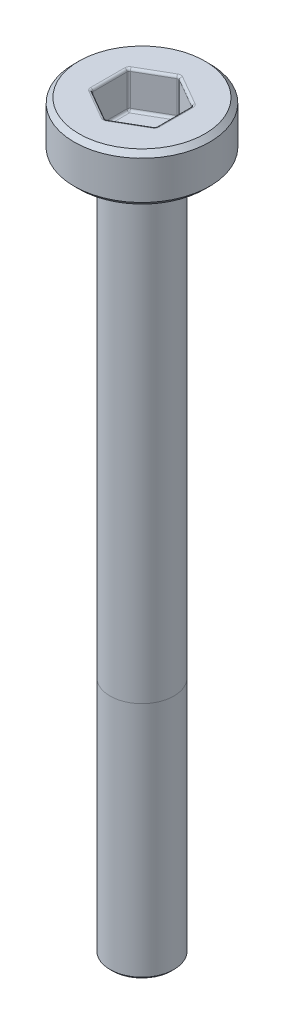
ISO-10303-21;
HEADER;
FILE_DESCRIPTION(('STEP AP214'),'2;1');
FILE_NAME('part.step','',(''),(''),'','','');
FILE_SCHEMA(('AUTOMOTIVE_DESIGN { 1 0 10303 214 1 1 1 1 }'));
ENDSEC;
DATA;
#1=APPLICATION_CONTEXT('core data for automotive mechanical design processes');
#2=APPLICATION_PROTOCOL_DEFINITION('international standard','automotive_design',2000,#1);
#3=PRODUCT_CONTEXT('',#1,'mechanical');
#4=PRODUCT('Part','Part','',(#3));
#5=PRODUCT_RELATED_PRODUCT_CATEGORY('part','',(#4));
#6=PRODUCT_DEFINITION_FORMATION('','',#4);
#7=PRODUCT_DEFINITION_CONTEXT('part definition',#1,'design');
#8=PRODUCT_DEFINITION('design','',#6,#7);
#9=PRODUCT_DEFINITION_SHAPE('','',#8);
#10=(LENGTH_UNIT() NAMED_UNIT(*) SI_UNIT(.MILLI.,.METRE.));
#11=(NAMED_UNIT(*) PLANE_ANGLE_UNIT() SI_UNIT($,.RADIAN.));
#12=(NAMED_UNIT(*) SI_UNIT($,.STERADIAN.) SOLID_ANGLE_UNIT());
#13=UNCERTAINTY_MEASURE_WITH_UNIT(LENGTH_MEASURE(1.E-05),#10,'distance_accuracy_value','');
#14=(GEOMETRIC_REPRESENTATION_CONTEXT(3) GLOBAL_UNCERTAINTY_ASSIGNED_CONTEXT((#13)) GLOBAL_UNIT_ASSIGNED_CONTEXT((#10,
#11,#12)) REPRESENTATION_CONTEXT('',''));
#15=CARTESIAN_POINT('',(0.,0.,0.));
#16=DIRECTION('',(0.,0.,1.));
#17=DIRECTION('',(1.,0.,0.));
#18=AXIS2_PLACEMENT_3D('',#15,#16,#17);
#19=CARTESIAN_POINT('',(0.,21.75,0.));
#20=DIRECTION('',(0.,-1.,0.));
#21=DIRECTION('',(0.,0.,-1.));
#22=AXIS2_PLACEMENT_3D('',#19,#20,#21);
#23=CYLINDRICAL_SURFACE('',#22,1.);
#24=CARTESIAN_POINT('',(0.,0.0750000000000056,0.));
#25=DIRECTION('',(0.,1.,0.));
#26=DIRECTION('',(0.,0.,1.));
#27=AXIS2_PLACEMENT_3D('',#24,#25,#26);
#28=CIRCLE('',#27,1.);
#29=CARTESIAN_POINT('',(0.,0.0750000000000056,1.));
#30=VERTEX_POINT('',#29);
#31=EDGE_CURVE('E319',#30,#30,#28,.T.);
#32=ORIENTED_EDGE('',*,*,#31,.T.);
#33=EDGE_LOOP('',(#32));
#34=FACE_BOUND('',#33,.T.);
#35=CARTESIAN_POINT('',(0.,7.5,0.));
#36=DIRECTION('',(0.,1.,0.));
#37=DIRECTION('',(0.,0.,1.));
#38=AXIS2_PLACEMENT_3D('',#35,#36,#37);
#39=CIRCLE('',#38,1.);
#40=CARTESIAN_POINT('',(0.,7.5,1.));
#41=VERTEX_POINT('',#40);
#42=EDGE_CURVE('E11',#41,#41,#39,.T.);
#43=ORIENTED_EDGE('',*,*,#42,.F.);
#44=EDGE_LOOP('',(#43));
#45=FACE_BOUND('',#44,.T.);
#46=ADVANCED_FACE('F38',(#34,#45),#23,.T.);
#47=ORIENTED_EDGE('',*,*,#42,.T.);
#48=EDGE_LOOP('',(#47));
#49=FACE_BOUND('',#48,.T.);
#50=CARTESIAN_POINT('',(0.,21.6,0.));
#51=DIRECTION('',(0.,1.,0.));
#52=DIRECTION('',(0.,0.,1.));
#53=AXIS2_PLACEMENT_3D('',#50,#51,#52);
#54=CIRCLE('',#53,1.);
#55=CARTESIAN_POINT('',(0.,21.6,1.));
#56=VERTEX_POINT('',#55);
#57=EDGE_CURVE('E300',#56,#56,#54,.F.);
#58=ORIENTED_EDGE('',*,*,#57,.T.);
#59=EDGE_LOOP('',(#58));
#60=FACE_BOUND('',#59,.T.);
#61=ADVANCED_FACE('F500',(#49,#60),#23,.T.);
#62=CARTESIAN_POINT('',(0.,0.,0.));
#63=DIRECTION('',(0.,1.,0.));
#64=DIRECTION('',(0.,0.,1.));
#65=AXIS2_PLACEMENT_3D('',#62,#63,#64);
#66=PLANE('',#65);
#67=CARTESIAN_POINT('',(0.,0.,0.));
#68=DIRECTION('',(0.,1.,0.));
#69=DIRECTION('',(0.,0.,1.));
#70=AXIS2_PLACEMENT_3D('',#67,#68,#69);
#71=CIRCLE('',#70,0.924999999999999);
#72=CARTESIAN_POINT('',(0.,0.,0.924999999999999));
#73=VERTEX_POINT('',#72);
#74=EDGE_CURVE('E207',#73,#73,#71,.F.);
#75=ORIENTED_EDGE('',*,*,#74,.T.);
#76=EDGE_LOOP('',(#75));
#77=FACE_BOUND('',#76,.T.);
#78=ADVANCED_FACE('F506',(#77),#66,.F.);
#79=CARTESIAN_POINT('',(0.,23.25,0.));
#80=DIRECTION('',(0.,-1.,0.));
#81=DIRECTION('',(0.,0.,-1.));
#82=AXIS2_PLACEMENT_3D('',#79,#80,#81);
#83=CYLINDRICAL_SURFACE('',#82,2.125);
#84=CARTESIAN_POINT('',(0.,23.1,0.));
#85=DIRECTION('',(0.,1.,0.));
#86=DIRECTION('',(0.,0.,1.));
#87=AXIS2_PLACEMENT_3D('',#84,#85,#86);
#88=CIRCLE('',#87,2.125);
#89=CARTESIAN_POINT('',(0.,23.1,2.125));
#90=VERTEX_POINT('',#89);
#91=EDGE_CURVE('E313',#90,#90,#88,.F.);
#92=ORIENTED_EDGE('',*,*,#91,.T.);
#93=EDGE_LOOP('',(#92));
#94=FACE_BOUND('',#93,.T.);
#95=CARTESIAN_POINT('',(0.,21.9,0.));
#96=DIRECTION('',(0.,1.,0.));
#97=DIRECTION('',(0.,0.,1.));
#98=AXIS2_PLACEMENT_3D('',#95,#96,#97);
#99=CIRCLE('',#98,2.125);
#100=CARTESIAN_POINT('',(0.,21.9,2.125));
#101=VERTEX_POINT('',#100);
#102=EDGE_CURVE('E310',#101,#101,#99,.T.);
#103=ORIENTED_EDGE('',*,*,#102,.T.);
#104=EDGE_LOOP('',(#103));
#105=FACE_BOUND('',#104,.T.);
#106=ADVANCED_FACE('F551',(#94,#105),#83,.T.);
#107=CARTESIAN_POINT('',(0.,23.25,0.));
#108=DIRECTION('',(0.,1.,0.));
#109=DIRECTION('',(0.,0.,1.));
#110=AXIS2_PLACEMENT_3D('',#107,#108,#109);
#111=PLANE('',#110);
#112=CARTESIAN_POINT('',(-0.925,23.25,0.534048999000404));
#113=DIRECTION('',(0.,1.,0.));
#114=DIRECTION('',(0.,0.,1.));
#115=AXIS2_PLACEMENT_3D('',#112,#113,#114);
#116=CIRCLE('',#115,0.15);
#117=CARTESIAN_POINT('',(-1.075,23.25,0.534048999000404));
#118=VERTEX_POINT('',#117);
#119=CARTESIAN_POINT('',(-1.,23.25,0.66395280956807));
#120=VERTEX_POINT('',#119);
#121=EDGE_CURVE('E349',#118,#120,#116,.T.);
#122=ORIENTED_EDGE('',*,*,#121,.F.);
#123=DIRECTION('',(0.,0.,1.));
#124=VECTOR('',#123,1.);
#125=CARTESIAN_POINT('',(-1.075,23.25,-0.577350269189626));
#126=LINE('',#125,#124);
#127=CARTESIAN_POINT('',(-1.075,23.25,-0.534048999000404));
#128=VERTEX_POINT('',#127);
#129=EDGE_CURVE('E355',#118,#128,#126,.F.);
#130=ORIENTED_EDGE('',*,*,#129,.T.);
#131=CARTESIAN_POINT('',(-0.925,23.25,-0.534048999000404));
#132=DIRECTION('',(0.,1.,0.));
#133=DIRECTION('',(0.,0.,1.));
#134=AXIS2_PLACEMENT_3D('',#131,#132,#133);
#135=CIRCLE('',#134,0.15);
#136=CARTESIAN_POINT('',(-1.,23.25,-0.663952809568069));
#137=VERTEX_POINT('',#136);
#138=EDGE_CURVE('E352',#137,#128,#135,.T.);
#139=ORIENTED_EDGE('',*,*,#138,.F.);
#140=DIRECTION('',(-0.866025403784439,0.,0.5));
#141=VECTOR('',#140,1.);
#142=CARTESIAN_POINT('',(-0.0375,23.25,-1.21965244366308));
#143=LINE('',#142,#141);
#144=CARTESIAN_POINT('',(-0.0750000000000002,23.25,-1.19800180856847));
#145=VERTEX_POINT('',#144);
#146=EDGE_CURVE('E347',#137,#145,#143,.F.);
#147=ORIENTED_EDGE('',*,*,#146,.T.);
#148=CARTESIAN_POINT('',(0.,23.25,-1.06809799800081));
#149=DIRECTION('',(0.,1.,0.));
#150=DIRECTION('',(0.,0.,1.));
#151=AXIS2_PLACEMENT_3D('',#148,#149,#150);
#152=CIRCLE('',#151,0.15);
#153=CARTESIAN_POINT('',(0.0749999999999997,23.25,-1.19800180856847));
#154=VERTEX_POINT('',#153);
#155=EDGE_CURVE('E344',#154,#145,#152,.T.);
#156=ORIENTED_EDGE('',*,*,#155,.F.);
#157=DIRECTION('',(-0.866025403784439,0.,-0.5));
#158=VECTOR('',#157,1.);
#159=CARTESIAN_POINT('',(1.0375,23.25,-0.642302174473459));
#160=LINE('',#159,#158);
#161=CARTESIAN_POINT('',(0.999999999999999,23.25,-0.66395280956807));
#162=VERTEX_POINT('',#161);
#163=EDGE_CURVE('E336',#154,#162,#160,.F.);
#164=ORIENTED_EDGE('',*,*,#163,.T.);
#165=CARTESIAN_POINT('',(0.924999999999999,23.25,-0.534048999000404));
#166=DIRECTION('',(0.,1.,0.));
#167=DIRECTION('',(0.,0.,1.));
#168=AXIS2_PLACEMENT_3D('',#165,#166,#167);
#169=CIRCLE('',#168,0.15);
#170=CARTESIAN_POINT('',(1.075,23.25,-0.534048999000404));
#171=VERTEX_POINT('',#170);
#172=EDGE_CURVE('E333',#171,#162,#169,.T.);
#173=ORIENTED_EDGE('',*,*,#172,.F.);
#174=DIRECTION('',(0.,0.,-1.));
#175=VECTOR('',#174,1.);
#176=CARTESIAN_POINT('',(1.075,23.25,0.577350269189626));
#177=LINE('',#176,#175);
#178=CARTESIAN_POINT('',(1.075,23.25,0.534048999000404));
#179=VERTEX_POINT('',#178);
#180=EDGE_CURVE('E329',#171,#179,#177,.F.);
#181=ORIENTED_EDGE('',*,*,#180,.T.);
#182=CARTESIAN_POINT('',(0.925,23.25,0.534048999000404));
#183=DIRECTION('',(0.,1.,0.));
#184=DIRECTION('',(0.,0.,1.));
#185=AXIS2_PLACEMENT_3D('',#182,#183,#184);
#186=CIRCLE('',#185,0.15);
#187=CARTESIAN_POINT('',(1.,23.25,0.66395280956807));
#188=VERTEX_POINT('',#187);
#189=EDGE_CURVE('E326',#188,#179,#186,.T.);
#190=ORIENTED_EDGE('',*,*,#189,.F.);
#191=DIRECTION('',(0.866025403784438,0.,-0.5));
#192=VECTOR('',#191,1.);
#193=CARTESIAN_POINT('',(0.0375000000000006,23.25,1.21965244366308));
#194=LINE('',#193,#192);
#195=CARTESIAN_POINT('',(0.0750000000000007,23.25,1.19800180856847));
#196=VERTEX_POINT('',#195);
#197=EDGE_CURVE('E331',#188,#196,#194,.F.);
#198=ORIENTED_EDGE('',*,*,#197,.T.);
#199=CARTESIAN_POINT('',(0.,23.25,1.06809799800081));
#200=DIRECTION('',(0.,1.,0.));
#201=DIRECTION('',(0.,0.,1.));
#202=AXIS2_PLACEMENT_3D('',#199,#200,#201);
#203=CIRCLE('',#202,0.15);
#204=CARTESIAN_POINT('',(-0.0749999999999991,23.25,1.19800180856847));
#205=VERTEX_POINT('',#204);
#206=EDGE_CURVE('E339',#205,#196,#203,.T.);
#207=ORIENTED_EDGE('',*,*,#206,.F.);
#208=DIRECTION('',(0.866025403784439,0.,0.5));
#209=VECTOR('',#208,1.);
#210=CARTESIAN_POINT('',(-1.0375,23.25,0.642302174473459));
#211=LINE('',#210,#209);
#212=EDGE_CURVE('E342',#205,#120,#211,.F.);
#213=ORIENTED_EDGE('',*,*,#212,.T.);
#214=EDGE_LOOP('',(#122,#130,#139,#147,#156,#164,#173,#181,#190,#198,#207,#213));
#215=FACE_BOUND('',#214,.T.);
#216=CARTESIAN_POINT('',(0.,23.25,0.));
#217=DIRECTION('',(0.,1.,0.));
#218=DIRECTION('',(0.,0.,1.));
#219=AXIS2_PLACEMENT_3D('',#216,#217,#218);
#220=CIRCLE('',#219,1.975);
#221=CARTESIAN_POINT('',(0.,23.25,1.975));
#222=VERTEX_POINT('',#221);
#223=EDGE_CURVE('E305',#222,#222,#220,.T.);
#224=ORIENTED_EDGE('',*,*,#223,.T.);
#225=EDGE_LOOP('',(#224));
#226=FACE_BOUND('',#225,.T.);
#227=ADVANCED_FACE('F450',(#215,#226),#111,.T.);
#228=CARTESIAN_POINT('',(0.,21.75,0.));
#229=DIRECTION('',(0.,1.,0.));
#230=DIRECTION('',(0.,0.,1.));
#231=AXIS2_PLACEMENT_3D('',#228,#229,#230);
#232=PLANE('',#231);
#233=CARTESIAN_POINT('',(0.,21.75,0.));
#234=DIRECTION('',(0.,1.,0.));
#235=DIRECTION('',(0.,0.,1.));
#236=AXIS2_PLACEMENT_3D('',#233,#234,#235);
#237=CIRCLE('',#236,1.975);
#238=CARTESIAN_POINT('',(0.,21.75,1.975));
#239=VERTEX_POINT('',#238);
#240=EDGE_CURVE('E316',#239,#239,#237,.F.);
#241=ORIENTED_EDGE('',*,*,#240,.T.);
#242=EDGE_LOOP('',(#241));
#243=FACE_BOUND('',#242,.T.);
#244=CARTESIAN_POINT('',(0.,21.75,0.));
#245=DIRECTION('',(0.,1.,0.));
#246=DIRECTION('',(0.,0.,1.));
#247=AXIS2_PLACEMENT_3D('',#244,#245,#246);
#248=CIRCLE('',#247,1.15);
#249=CARTESIAN_POINT('',(0.,21.75,1.15));
#250=VERTEX_POINT('',#249);
#251=EDGE_CURVE('E294',#250,#250,#248,.T.);
#252=ORIENTED_EDGE('',*,*,#251,.T.);
#253=EDGE_LOOP('',(#252));
#254=FACE_BOUND('',#253,.T.);
#255=ADVANCED_FACE('F516',(#243,#254),#232,.F.);
#256=CARTESIAN_POINT('',(0.,21.6,0.));
#257=DIRECTION('',(0.,1.,0.));
#258=DIRECTION('',(0.,0.,1.));
#259=AXIS2_PLACEMENT_3D('',#256,#257,#258);
#260=TOROIDAL_SURFACE('',#259,1.15,0.15);
#261=ORIENTED_EDGE('',*,*,#57,.F.);
#262=EDGE_LOOP('',(#261));
#263=FACE_BOUND('',#262,.T.);
#264=ORIENTED_EDGE('',*,*,#251,.F.);
#265=EDGE_LOOP('',(#264));
#266=FACE_BOUND('',#265,.T.);
#267=ADVANCED_FACE('F512',(#263,#266),#260,.F.);
#268=CARTESIAN_POINT('',(0.,23.25,0.));
#269=DIRECTION('',(0.,-1.,0.));
#270=DIRECTION('',(0.,0.,-1.));
#271=AXIS2_PLACEMENT_3D('',#268,#269,#270);
#272=CONICAL_SURFACE('',#271,1.975,0.785398163397443);
#273=ORIENTED_EDGE('',*,*,#91,.F.);
#274=EDGE_LOOP('',(#273));
#275=FACE_BOUND('',#274,.T.);
#276=ORIENTED_EDGE('',*,*,#223,.F.);
#277=EDGE_LOOP('',(#276));
#278=FACE_BOUND('',#277,.T.);
#279=ADVANCED_FACE('F515',(#275,#278),#272,.T.);
#280=CARTESIAN_POINT('',(0.,21.9,0.));
#281=DIRECTION('',(0.,1.,0.));
#282=DIRECTION('',(0.,0.,1.));
#283=AXIS2_PLACEMENT_3D('',#280,#281,#282);
#284=CONICAL_SURFACE('',#283,2.125,0.785398163397437);
#285=ORIENTED_EDGE('',*,*,#240,.F.);
#286=EDGE_LOOP('',(#285));
#287=FACE_BOUND('',#286,.T.);
#288=ORIENTED_EDGE('',*,*,#102,.F.);
#289=EDGE_LOOP('',(#288));
#290=FACE_BOUND('',#289,.T.);
#291=ADVANCED_FACE('F524',(#287,#290),#284,.T.);
#292=CARTESIAN_POINT('',(0.999999999999999,22.1,-0.577350269189626));
#293=DIRECTION('',(0.5,0.,-0.866025403784439));
#294=DIRECTION('',(-0.866025403784439,0.,-0.5));
#295=AXIS2_PLACEMENT_3D('',#292,#293,#294);
#296=PLANE('',#295);
#297=DIRECTION('',(0.,1.,0.));
#298=VECTOR('',#297,1.);
#299=CARTESIAN_POINT('',(0.962499999999999,23.25,-0.599000904284237));
#300=LINE('',#299,#298);
#301=CARTESIAN_POINT('',(0.962499999999999,22.175,-0.599000904284237));
#302=VERTEX_POINT('',#301);
#303=CARTESIAN_POINT('',(0.962499999999999,23.175,-0.599000904284237));
#304=VERTEX_POINT('',#303);
#305=EDGE_CURVE('E195',#302,#304,#300,.T.);
#306=ORIENTED_EDGE('',*,*,#305,.T.);
#307=DIRECTION('',(-0.866025403784439,0.,-0.5));
#308=VECTOR('',#307,1.);
#309=CARTESIAN_POINT('',(0.,23.175,-1.15470053837925));
#310=LINE('',#309,#308);
#311=CARTESIAN_POINT('',(0.0374999999999997,23.175,-1.13304990328464));
#312=VERTEX_POINT('',#311);
#313=EDGE_CURVE('E191',#304,#312,#310,.T.);
#314=ORIENTED_EDGE('',*,*,#313,.T.);
#315=DIRECTION('',(0.,1.,0.));
#316=VECTOR('',#315,1.);
#317=CARTESIAN_POINT('',(0.0374999999999997,22.1,-1.13304990328464));
#318=LINE('',#317,#316);
#319=CARTESIAN_POINT('',(0.0374999999999997,22.175,-1.13304990328464));
#320=VERTEX_POINT('',#319);
#321=EDGE_CURVE('E185',#312,#320,#318,.F.);
#322=ORIENTED_EDGE('',*,*,#321,.T.);
#323=DIRECTION('',(-0.866025403784439,0.,-0.5));
#324=VECTOR('',#323,1.);
#325=CARTESIAN_POINT('',(0.999999999999999,22.175,-0.577350269189626));
#326=LINE('',#325,#324);
#327=EDGE_CURVE('E188',#320,#302,#326,.F.);
#328=ORIENTED_EDGE('',*,*,#327,.T.);
#329=EDGE_LOOP('',(#306,#314,#322,#328));
#330=FACE_BOUND('',#329,.T.);
#331=ADVANCED_FACE('F187',(#330),#296,.F.);
#332=CARTESIAN_POINT('',(1.,22.1,0.577350269189626));
#333=DIRECTION('',(1.,0.,0.));
#334=DIRECTION('',(0.,0.,-1.));
#335=AXIS2_PLACEMENT_3D('',#332,#333,#334);
#336=PLANE('',#335);
#337=DIRECTION('',(0.,0.,-1.));
#338=VECTOR('',#337,1.);
#339=CARTESIAN_POINT('',(1.,22.175,0.577350269189626));
#340=LINE('',#339,#338);
#341=CARTESIAN_POINT('',(0.999999999999999,22.175,-0.534048999000404));
#342=VERTEX_POINT('',#341);
#343=CARTESIAN_POINT('',(1.,22.175,0.534048999000404));
#344=VERTEX_POINT('',#343);
#345=EDGE_CURVE('E394',#342,#344,#340,.F.);
#346=ORIENTED_EDGE('',*,*,#345,.T.);
#347=DIRECTION('',(0.,1.,0.));
#348=VECTOR('',#347,1.);
#349=CARTESIAN_POINT('',(1.,23.25,0.534048999000404));
#350=LINE('',#349,#348);
#351=CARTESIAN_POINT('',(1.,23.175,0.534048999000404));
#352=VERTEX_POINT('',#351);
#353=EDGE_CURVE('E399',#344,#352,#350,.T.);
#354=ORIENTED_EDGE('',*,*,#353,.T.);
#355=DIRECTION('',(0.,0.,-1.));
#356=VECTOR('',#355,1.);
#357=CARTESIAN_POINT('',(0.999999999999999,23.175,-0.577350269189626));
#358=LINE('',#357,#356);
#359=CARTESIAN_POINT('',(0.999999999999999,23.175,-0.534048999000404));
#360=VERTEX_POINT('',#359);
#361=EDGE_CURVE('E396',#352,#360,#358,.T.);
#362=ORIENTED_EDGE('',*,*,#361,.T.);
#363=DIRECTION('',(0.,1.,0.));
#364=VECTOR('',#363,1.);
#365=CARTESIAN_POINT('',(0.999999999999999,22.1,-0.534048999000404));
#366=LINE('',#365,#364);
#367=EDGE_CURVE('E392',#360,#342,#366,.F.);
#368=ORIENTED_EDGE('',*,*,#367,.T.);
#369=EDGE_LOOP('',(#346,#354,#362,#368));
#370=FACE_BOUND('',#369,.T.);
#371=ADVANCED_FACE('F438',(#370),#336,.F.);
#372=CARTESIAN_POINT('',(0.,22.1,1.15470053837925));
#373=DIRECTION('',(0.5,0.,0.866025403784439));
#374=DIRECTION('',(0.866025403784438,0.,-0.5));
#375=AXIS2_PLACEMENT_3D('',#372,#373,#374);
#376=PLANE('',#375);
#377=DIRECTION('',(0.866025403784438,0.,-0.5));
#378=VECTOR('',#377,1.);
#379=CARTESIAN_POINT('',(0.,22.175,1.15470053837925));
#380=LINE('',#379,#378);
#381=CARTESIAN_POINT('',(0.9625,22.175,0.599000904284237));
#382=VERTEX_POINT('',#381);
#383=CARTESIAN_POINT('',(0.0375000000000007,22.175,1.13304990328464));
#384=VERTEX_POINT('',#383);
#385=EDGE_CURVE('E385',#382,#384,#380,.F.);
#386=ORIENTED_EDGE('',*,*,#385,.T.);
#387=DIRECTION('',(0.,1.,0.));
#388=VECTOR('',#387,1.);
#389=CARTESIAN_POINT('',(0.0375000000000008,23.25,1.13304990328464));
#390=LINE('',#389,#388);
#391=CARTESIAN_POINT('',(0.0375000000000007,23.175,1.13304990328464));
#392=VERTEX_POINT('',#391);
#393=EDGE_CURVE('E390',#384,#392,#390,.T.);
#394=ORIENTED_EDGE('',*,*,#393,.T.);
#395=DIRECTION('',(0.866025403784438,0.,-0.5));
#396=VECTOR('',#395,1.);
#397=CARTESIAN_POINT('',(0.999999999999999,23.175,0.577350269189626));
#398=LINE('',#397,#396);
#399=CARTESIAN_POINT('',(0.9625,23.175,0.599000904284237));
#400=VERTEX_POINT('',#399);
#401=EDGE_CURVE('E387',#392,#400,#398,.T.);
#402=ORIENTED_EDGE('',*,*,#401,.T.);
#403=DIRECTION('',(0.,1.,0.));
#404=VECTOR('',#403,1.);
#405=CARTESIAN_POINT('',(0.9625,22.1,0.599000904284237));
#406=LINE('',#405,#404);
#407=EDGE_CURVE('E383',#400,#382,#406,.F.);
#408=ORIENTED_EDGE('',*,*,#407,.T.);
#409=EDGE_LOOP('',(#386,#394,#402,#408));
#410=FACE_BOUND('',#409,.T.);
#411=ADVANCED_FACE('F577',(#410),#376,.F.);
#412=CARTESIAN_POINT('',(-1.,22.1,0.577350269189626));
#413=DIRECTION('',(-0.5,0.,0.866025403784439));
#414=DIRECTION('',(0.866025403784439,0.,0.5));
#415=AXIS2_PLACEMENT_3D('',#412,#413,#414);
#416=PLANE('',#415);
#417=DIRECTION('',(0.866025403784439,0.,0.5));
#418=VECTOR('',#417,1.);
#419=CARTESIAN_POINT('',(-1.,22.175,0.577350269189626));
#420=LINE('',#419,#418);
#421=CARTESIAN_POINT('',(-0.0374999999999992,22.175,1.13304990328464));
#422=VERTEX_POINT('',#421);
#423=CARTESIAN_POINT('',(-0.9625,22.175,0.599000904284237));
#424=VERTEX_POINT('',#423);
#425=EDGE_CURVE('E376',#422,#424,#420,.F.);
#426=ORIENTED_EDGE('',*,*,#425,.T.);
#427=DIRECTION('',(0.,1.,0.));
#428=VECTOR('',#427,1.);
#429=CARTESIAN_POINT('',(-0.9625,23.25,0.599000904284237));
#430=LINE('',#429,#428);
#431=CARTESIAN_POINT('',(-0.9625,23.175,0.599000904284237));
#432=VERTEX_POINT('',#431);
#433=EDGE_CURVE('E381',#424,#432,#430,.T.);
#434=ORIENTED_EDGE('',*,*,#433,.T.);
#435=DIRECTION('',(0.866025403784439,0.,0.5));
#436=VECTOR('',#435,1.);
#437=CARTESIAN_POINT('',(0.,23.175,1.15470053837925));
#438=LINE('',#437,#436);
#439=CARTESIAN_POINT('',(-0.0374999999999992,23.175,1.13304990328464));
#440=VERTEX_POINT('',#439);
#441=EDGE_CURVE('E378',#432,#440,#438,.T.);
#442=ORIENTED_EDGE('',*,*,#441,.T.);
#443=DIRECTION('',(0.,1.,0.));
#444=VECTOR('',#443,1.);
#445=CARTESIAN_POINT('',(-0.0374999999999992,22.1,1.13304990328464));
#446=LINE('',#445,#444);
#447=EDGE_CURVE('E374',#440,#422,#446,.F.);
#448=ORIENTED_EDGE('',*,*,#447,.T.);
#449=EDGE_LOOP('',(#426,#434,#442,#448));
#450=FACE_BOUND('',#449,.T.);
#451=ADVANCED_FACE('F573',(#450),#416,.F.);
#452=CARTESIAN_POINT('',(-1.,22.1,-0.577350269189626));
#453=DIRECTION('',(-1.,0.,0.));
#454=DIRECTION('',(0.,0.,1.));
#455=AXIS2_PLACEMENT_3D('',#452,#453,#454);
#456=PLANE('',#455);
#457=DIRECTION('',(0.,0.,1.));
#458=VECTOR('',#457,1.);
#459=CARTESIAN_POINT('',(-1.,22.175,-0.577350269189626));
#460=LINE('',#459,#458);
#461=CARTESIAN_POINT('',(-1.,22.175,0.534048999000404));
#462=VERTEX_POINT('',#461);
#463=CARTESIAN_POINT('',(-1.,22.175,-0.534048999000404));
#464=VERTEX_POINT('',#463);
#465=EDGE_CURVE('E367',#462,#464,#460,.F.);
#466=ORIENTED_EDGE('',*,*,#465,.T.);
#467=DIRECTION('',(0.,1.,0.));
#468=VECTOR('',#467,1.);
#469=CARTESIAN_POINT('',(-1.,23.25,-0.534048999000404));
#470=LINE('',#469,#468);
#471=CARTESIAN_POINT('',(-1.,23.175,-0.534048999000404));
#472=VERTEX_POINT('',#471);
#473=EDGE_CURVE('E372',#464,#472,#470,.T.);
#474=ORIENTED_EDGE('',*,*,#473,.T.);
#475=DIRECTION('',(0.,0.,1.));
#476=VECTOR('',#475,1.);
#477=CARTESIAN_POINT('',(-1.,23.175,0.577350269189626));
#478=LINE('',#477,#476);
#479=CARTESIAN_POINT('',(-1.,23.175,0.534048999000404));
#480=VERTEX_POINT('',#479);
#481=EDGE_CURVE('E369',#472,#480,#478,.T.);
#482=ORIENTED_EDGE('',*,*,#481,.T.);
#483=DIRECTION('',(0.,1.,0.));
#484=VECTOR('',#483,1.);
#485=CARTESIAN_POINT('',(-1.,22.1,0.534048999000404));
#486=LINE('',#485,#484);
#487=EDGE_CURVE('E365',#480,#462,#486,.F.);
#488=ORIENTED_EDGE('',*,*,#487,.T.);
#489=EDGE_LOOP('',(#466,#474,#482,#488));
#490=FACE_BOUND('',#489,.T.);
#491=ADVANCED_FACE('F569',(#490),#456,.F.);
#492=CARTESIAN_POINT('',(0.,22.1,-1.15470053837925));
#493=DIRECTION('',(-0.5,0.,-0.866025403784439));
#494=DIRECTION('',(-0.866025403784439,0.,0.5));
#495=AXIS2_PLACEMENT_3D('',#492,#493,#494);
#496=PLANE('',#495);
#497=DIRECTION('',(-0.866025403784439,0.,0.5));
#498=VECTOR('',#497,1.);
#499=CARTESIAN_POINT('',(0.,22.175,-1.15470053837925));
#500=LINE('',#499,#498);
#501=CARTESIAN_POINT('',(-0.9625,22.175,-0.599000904284237));
#502=VERTEX_POINT('',#501);
#503=CARTESIAN_POINT('',(-0.0375000000000003,22.175,-1.13304990328464));
#504=VERTEX_POINT('',#503);
#505=EDGE_CURVE('E359',#502,#504,#500,.F.);
#506=ORIENTED_EDGE('',*,*,#505,.T.);
#507=DIRECTION('',(0.,1.,0.));
#508=VECTOR('',#507,1.);
#509=CARTESIAN_POINT('',(-0.0375000000000003,23.25,-1.13304990328464));
#510=LINE('',#509,#508);
#511=CARTESIAN_POINT('',(-0.0375000000000003,23.175,-1.13304990328464));
#512=VERTEX_POINT('',#511);
#513=EDGE_CURVE('E218',#504,#512,#510,.T.);
#514=ORIENTED_EDGE('',*,*,#513,.T.);
#515=DIRECTION('',(-0.866025403784439,0.,0.5));
#516=VECTOR('',#515,1.);
#517=CARTESIAN_POINT('',(-1.,23.175,-0.577350269189626));
#518=LINE('',#517,#516);
#519=CARTESIAN_POINT('',(-0.9625,23.175,-0.599000904284237));
#520=VERTEX_POINT('',#519);
#521=EDGE_CURVE('E361',#512,#520,#518,.T.);
#522=ORIENTED_EDGE('',*,*,#521,.T.);
#523=DIRECTION('',(0.,1.,0.));
#524=VECTOR('',#523,1.);
#525=CARTESIAN_POINT('',(-0.9625,22.1,-0.599000904284236));
#526=LINE('',#525,#524);
#527=EDGE_CURVE('E357',#520,#502,#526,.F.);
#528=ORIENTED_EDGE('',*,*,#527,.T.);
#529=EDGE_LOOP('',(#506,#514,#522,#528));
#530=FACE_BOUND('',#529,.T.);
#531=ADVANCED_FACE('F544',(#530),#496,.F.);
#532=CARTESIAN_POINT('',(0.,22.1,0.));
#533=DIRECTION('',(0.,1.,0.));
#534=DIRECTION('',(0.,0.,1.));
#535=AXIS2_PLACEMENT_3D('',#532,#533,#534);
#536=PLANE('',#535);
#537=DIRECTION('',(-0.866025403784439,0.,-0.5));
#538=VECTOR('',#537,1.);
#539=CARTESIAN_POINT('',(0.462499999999999,22.1,-0.801073498500606));
#540=LINE('',#539,#538);
#541=CARTESIAN_POINT('',(0.924999999999999,22.1,-0.534048999000404));
#542=VERTEX_POINT('',#541);
#543=CARTESIAN_POINT('',(0.,22.1,-1.06809799800081));
#544=VERTEX_POINT('',#543);
#545=EDGE_CURVE('E401',#542,#544,#540,.T.);
#546=ORIENTED_EDGE('',*,*,#545,.T.);
#547=DIRECTION('',(-0.866025403784439,0.,0.5));
#548=VECTOR('',#547,1.);
#549=CARTESIAN_POINT('',(-0.4625,22.1,-0.801073498500606));
#550=LINE('',#549,#548);
#551=CARTESIAN_POINT('',(-0.925,22.1,-0.534048999000404));
#552=VERTEX_POINT('',#551);
#553=EDGE_CURVE('E47',#544,#552,#550,.T.);
#554=ORIENTED_EDGE('',*,*,#553,.T.);
#555=DIRECTION('',(0.,0.,1.));
#556=VECTOR('',#555,1.);
#557=CARTESIAN_POINT('',(-0.925,22.1,0.));
#558=LINE('',#557,#556);
#559=CARTESIAN_POINT('',(-0.925,22.1,0.534048999000404));
#560=VERTEX_POINT('',#559);
#561=EDGE_CURVE('E62',#552,#560,#558,.T.);
#562=ORIENTED_EDGE('',*,*,#561,.T.);
#563=DIRECTION('',(0.866025403784439,0.,0.5));
#564=VECTOR('',#563,1.);
#565=CARTESIAN_POINT('',(-0.462499999999999,22.1,0.801073498500606));
#566=LINE('',#565,#564);
#567=CARTESIAN_POINT('',(0.,22.1,1.06809799800081));
#568=VERTEX_POINT('',#567);
#569=EDGE_CURVE('E407',#560,#568,#566,.T.);
#570=ORIENTED_EDGE('',*,*,#569,.T.);
#571=DIRECTION('',(0.866025403784438,0.,-0.5));
#572=VECTOR('',#571,1.);
#573=CARTESIAN_POINT('',(0.4625,22.1,0.801073498500606));
#574=LINE('',#573,#572);
#575=CARTESIAN_POINT('',(0.925,22.1,0.534048999000404));
#576=VERTEX_POINT('',#575);
#577=EDGE_CURVE('E405',#568,#576,#574,.T.);
#578=ORIENTED_EDGE('',*,*,#577,.T.);
#579=DIRECTION('',(0.,0.,-1.));
#580=VECTOR('',#579,1.);
#581=CARTESIAN_POINT('',(0.924999999999999,22.1,0.));
#582=LINE('',#581,#580);
#583=EDGE_CURVE('E403',#576,#542,#582,.T.);
#584=ORIENTED_EDGE('',*,*,#583,.T.);
#585=EDGE_LOOP('',(#546,#554,#562,#570,#578,#584));
#586=FACE_BOUND('',#585,.T.);
#587=ADVANCED_FACE('F536',(#586),#536,.T.);
#588=CARTESIAN_POINT('',(0.,0.0750000000000056,0.));
#589=DIRECTION('',(0.,1.,0.));
#590=DIRECTION('',(0.,0.,1.));
#591=AXIS2_PLACEMENT_3D('',#588,#589,#590);
#592=CONICAL_SURFACE('',#591,1.,0.785398163397419);
#593=ORIENTED_EDGE('',*,*,#74,.F.);
#594=EDGE_LOOP('',(#593));
#595=FACE_BOUND('',#594,.T.);
#596=ORIENTED_EDGE('',*,*,#31,.F.);
#597=EDGE_LOOP('',(#596));
#598=FACE_BOUND('',#597,.T.);
#599=ADVANCED_FACE('F532',(#595,#598),#592,.T.);
#600=CARTESIAN_POINT('',(-0.462499999999999,22.175,0.801073498500606));
#601=DIRECTION('',(0.866025403784439,0.,0.5));
#602=DIRECTION('',(0.5,0.,-0.866025403784439));
#603=AXIS2_PLACEMENT_3D('',#600,#601,#602);
#604=CYLINDRICAL_SURFACE('',#603,0.075);
#605=CARTESIAN_POINT('',(0.,22.175,1.06809799800081));
#606=DIRECTION('',(-0.866025403784437,0.,-0.500000000000003));
#607=DIRECTION('',(-0.500000000000003,0.,0.866025403784437));
#608=AXIS2_PLACEMENT_3D('',#605,#606,#607);
#609=CIRCLE('',#608,0.075);
#610=EDGE_CURVE('E292',#568,#422,#609,.T.);
#611=ORIENTED_EDGE('',*,*,#610,.F.);
#612=ORIENTED_EDGE('',*,*,#569,.F.);
#613=CARTESIAN_POINT('',(-0.925,22.175,0.534048999000404));
#614=DIRECTION('',(0.866025403784439,0.,0.499999999999999));
#615=DIRECTION('',(0.499999999999999,0.,-0.866025403784439));
#616=AXIS2_PLACEMENT_3D('',#613,#614,#615);
#617=CIRCLE('',#616,0.075);
#618=EDGE_CURVE('E290',#424,#560,#617,.T.);
#619=ORIENTED_EDGE('',*,*,#618,.F.);
#620=ORIENTED_EDGE('',*,*,#425,.F.);
#621=EDGE_LOOP('',(#611,#612,#619,#620));
#622=FACE_BOUND('',#621,.T.);
#623=ADVANCED_FACE('F40',(#622),#604,.F.);
#624=CARTESIAN_POINT('',(0.,22.175,1.06809799800081));
#625=DIRECTION('',(0.,0.,1.));
#626=DIRECTION('',(1.,0.,0.));
#627=AXIS2_PLACEMENT_3D('',#624,#625,#626);
#628=SPHERICAL_SURFACE('',#627,0.075);
#629=CARTESIAN_POINT('',(0.,22.175,1.06809799800081));
#630=DIRECTION('',(0.866025403784439,0.,-0.5));
#631=DIRECTION('',(-0.5,0.,-0.866025403784439));
#632=AXIS2_PLACEMENT_3D('',#629,#630,#631);
#633=CIRCLE('',#632,0.075);
#634=EDGE_CURVE('E284',#568,#384,#633,.F.);
#635=ORIENTED_EDGE('',*,*,#634,.F.);
#636=ORIENTED_EDGE('',*,*,#610,.T.);
#637=CARTESIAN_POINT('',(0.,22.175,1.06809799800081));
#638=DIRECTION('',(0.,1.,0.));
#639=DIRECTION('',(0.,0.,1.));
#640=AXIS2_PLACEMENT_3D('',#637,#638,#639);
#641=CIRCLE('',#640,0.075);
#642=EDGE_CURVE('E287',#384,#422,#641,.F.);
#643=ORIENTED_EDGE('',*,*,#642,.F.);
#644=EDGE_LOOP('',(#635,#636,#643));
#645=FACE_BOUND('',#644,.T.);
#646=ADVANCED_FACE('F542',(#645),#628,.F.);
#647=CARTESIAN_POINT('',(-0.925,22.175,0.534048999000404));
#648=DIRECTION('',(0.,0.,1.));
#649=DIRECTION('',(1.,0.,0.));
#650=AXIS2_PLACEMENT_3D('',#647,#648,#649);
#651=SPHERICAL_SURFACE('',#650,0.075);
#652=CARTESIAN_POINT('',(-0.925,22.175,0.534048999000404));
#653=DIRECTION('',(0.,1.,0.));
#654=DIRECTION('',(0.,0.,1.));
#655=AXIS2_PLACEMENT_3D('',#652,#653,#654);
#656=CIRCLE('',#655,0.075);
#657=EDGE_CURVE('E278',#424,#462,#656,.F.);
#658=ORIENTED_EDGE('',*,*,#657,.F.);
#659=ORIENTED_EDGE('',*,*,#618,.T.);
#660=CARTESIAN_POINT('',(-0.925,22.175,0.534048999000404));
#661=DIRECTION('',(0.,0.,-1.));
#662=DIRECTION('',(-1.,0.,0.));
#663=AXIS2_PLACEMENT_3D('',#660,#661,#662);
#664=CIRCLE('',#663,0.075);
#665=EDGE_CURVE('E281',#462,#560,#664,.F.);
#666=ORIENTED_EDGE('',*,*,#665,.F.);
#667=EDGE_LOOP('',(#658,#659,#666));
#668=FACE_BOUND('',#667,.T.);
#669=ADVANCED_FACE('F623',(#668),#651,.F.);
#670=CARTESIAN_POINT('',(0.,22.1,1.06809799800081));
#671=DIRECTION('',(0.,-1.,0.));
#672=DIRECTION('',(0.,0.,-1.));
#673=AXIS2_PLACEMENT_3D('',#670,#671,#672);
#674=CYLINDRICAL_SURFACE('',#673,0.075);
#675=ORIENTED_EDGE('',*,*,#642,.T.);
#676=ORIENTED_EDGE('',*,*,#447,.F.);
#677=CARTESIAN_POINT('',(0.,23.175,1.06809799800081));
#678=DIRECTION('',(0.,1.,0.));
#679=DIRECTION('',(0.,0.,1.));
#680=AXIS2_PLACEMENT_3D('',#677,#678,#679);
#681=CIRCLE('',#680,0.075);
#682=EDGE_CURVE('E273',#392,#440,#681,.F.);
#683=ORIENTED_EDGE('',*,*,#682,.F.);
#684=ORIENTED_EDGE('',*,*,#393,.F.);
#685=EDGE_LOOP('',(#675,#676,#683,#684));
#686=FACE_BOUND('',#685,.T.);
#687=ADVANCED_FACE('F631',(#686),#674,.F.);
#688=CARTESIAN_POINT('',(0.4625,22.175,0.801073498500606));
#689=DIRECTION('',(0.866025403784438,0.,-0.5));
#690=DIRECTION('',(-0.5,0.,-0.866025403784439));
#691=AXIS2_PLACEMENT_3D('',#688,#689,#690);
#692=CYLINDRICAL_SURFACE('',#691,0.075);
#693=ORIENTED_EDGE('',*,*,#634,.T.);
#694=ORIENTED_EDGE('',*,*,#385,.F.);
#695=CARTESIAN_POINT('',(0.925,22.175,0.534048999000404));
#696=DIRECTION('',(-0.866025403784437,0.,0.500000000000002));
#697=DIRECTION('',(0.500000000000002,0.,0.866025403784437));
#698=AXIS2_PLACEMENT_3D('',#695,#696,#697);
#699=CIRCLE('',#698,0.075);
#700=EDGE_CURVE('E270',#576,#382,#699,.T.);
#701=ORIENTED_EDGE('',*,*,#700,.F.);
#702=ORIENTED_EDGE('',*,*,#577,.F.);
#703=EDGE_LOOP('',(#693,#694,#701,#702));
#704=FACE_BOUND('',#703,.T.);
#705=ADVANCED_FACE('F641',(#704),#692,.F.);
#706=CARTESIAN_POINT('',(-0.925,22.175,0.));
#707=DIRECTION('',(0.,0.,1.));
#708=DIRECTION('',(1.,0.,0.));
#709=AXIS2_PLACEMENT_3D('',#706,#707,#708);
#710=CYLINDRICAL_SURFACE('',#709,0.075);
#711=ORIENTED_EDGE('',*,*,#665,.T.);
#712=ORIENTED_EDGE('',*,*,#561,.F.);
#713=CARTESIAN_POINT('',(-0.925,22.175,-0.534048999000404));
#714=DIRECTION('',(0.,0.,1.));
#715=DIRECTION('',(1.,0.,0.));
#716=AXIS2_PLACEMENT_3D('',#713,#714,#715);
#717=CIRCLE('',#716,0.075);
#718=EDGE_CURVE('E268',#464,#552,#717,.T.);
#719=ORIENTED_EDGE('',*,*,#718,.F.);
#720=ORIENTED_EDGE('',*,*,#465,.F.);
#721=EDGE_LOOP('',(#711,#712,#719,#720));
#722=FACE_BOUND('',#721,.T.);
#723=ADVANCED_FACE('F651',(#722),#710,.F.);
#724=CARTESIAN_POINT('',(-0.925,22.1,0.534048999000404));
#725=DIRECTION('',(0.,-1.,0.));
#726=DIRECTION('',(0.,0.,-1.));
#727=AXIS2_PLACEMENT_3D('',#724,#725,#726);
#728=CYLINDRICAL_SURFACE('',#727,0.075);
#729=ORIENTED_EDGE('',*,*,#657,.T.);
#730=ORIENTED_EDGE('',*,*,#487,.F.);
#731=CARTESIAN_POINT('',(-0.925,23.175,0.534048999000404));
#732=DIRECTION('',(0.,1.,0.));
#733=DIRECTION('',(0.,0.,1.));
#734=AXIS2_PLACEMENT_3D('',#731,#732,#733);
#735=CIRCLE('',#734,0.075);
#736=EDGE_CURVE('E265',#432,#480,#735,.F.);
#737=ORIENTED_EDGE('',*,*,#736,.F.);
#738=ORIENTED_EDGE('',*,*,#433,.F.);
#739=EDGE_LOOP('',(#729,#730,#737,#738));
#740=FACE_BOUND('',#739,.T.);
#741=ADVANCED_FACE('F661',(#740),#728,.F.);
#742=CARTESIAN_POINT('',(-1.0375,23.175,0.642302174473459));
#743=DIRECTION('',(-0.866025403784439,0.,-0.5));
#744=DIRECTION('',(-0.5,0.,0.866025403784439));
#745=AXIS2_PLACEMENT_3D('',#742,#743,#744);
#746=CYLINDRICAL_SURFACE('',#745,0.075);
#747=CARTESIAN_POINT('',(-1.,23.175,0.66395280956807));
#748=DIRECTION('',(-0.866025403784439,0.,-0.5));
#749=DIRECTION('',(-0.5,0.,0.866025403784439));
#750=AXIS2_PLACEMENT_3D('',#747,#748,#749);
#751=CIRCLE('',#750,0.075);
#752=EDGE_CURVE('E262',#120,#432,#751,.T.);
#753=ORIENTED_EDGE('',*,*,#752,.F.);
#754=ORIENTED_EDGE('',*,*,#212,.F.);
#755=CARTESIAN_POINT('',(-0.0749999999999991,23.175,1.19800180856847));
#756=DIRECTION('',(0.866025403784439,0.,0.5));
#757=DIRECTION('',(0.5,0.,-0.866025403784439));
#758=AXIS2_PLACEMENT_3D('',#755,#756,#757);
#759=CIRCLE('',#758,0.075);
#760=EDGE_CURVE('E275',#440,#205,#759,.T.);
#761=ORIENTED_EDGE('',*,*,#760,.F.);
#762=ORIENTED_EDGE('',*,*,#441,.F.);
#763=EDGE_LOOP('',(#753,#754,#761,#762));
#764=FACE_BOUND('',#763,.T.);
#765=ADVANCED_FACE('F463',(#764),#746,.T.);
#766=CARTESIAN_POINT('',(0.,23.175,1.06809799800081));
#767=DIRECTION('',(0.,1.,0.));
#768=DIRECTION('',(0.,0.,1.));
#769=AXIS2_PLACEMENT_3D('',#766,#767,#768);
#770=TOROIDAL_SURFACE('',#769,0.15,0.075);
#771=ORIENTED_EDGE('',*,*,#760,.T.);
#772=ORIENTED_EDGE('',*,*,#206,.T.);
#773=CARTESIAN_POINT('',(0.0750000000000007,23.175,1.19800180856847));
#774=DIRECTION('',(-0.866025403784439,0.,0.5));
#775=DIRECTION('',(0.5,0.,0.866025403784439));
#776=AXIS2_PLACEMENT_3D('',#773,#774,#775);
#777=CIRCLE('',#776,0.075);
#778=EDGE_CURVE('E259',#392,#196,#777,.F.);
#779=ORIENTED_EDGE('',*,*,#778,.F.);
#780=ORIENTED_EDGE('',*,*,#682,.T.);
#781=EDGE_LOOP('',(#771,#772,#779,#780));
#782=FACE_BOUND('',#781,.T.);
#783=ADVANCED_FACE('F457',(#782),#770,.T.);
#784=CARTESIAN_POINT('',(0.925,22.175,0.534048999000404));
#785=DIRECTION('',(0.,0.,1.));
#786=DIRECTION('',(1.,0.,0.));
#787=AXIS2_PLACEMENT_3D('',#784,#785,#786);
#788=SPHERICAL_SURFACE('',#787,0.075);
#789=CARTESIAN_POINT('',(0.925,22.175,0.534048999000404));
#790=DIRECTION('',(0.,0.,-1.));
#791=DIRECTION('',(0.,1.,0.));
#792=AXIS2_PLACEMENT_3D('',#789,#790,#791);
#793=CIRCLE('',#792,0.075);
#794=EDGE_CURVE('E253',#576,#344,#793,.F.);
#795=ORIENTED_EDGE('',*,*,#794,.F.);
#796=ORIENTED_EDGE('',*,*,#700,.T.);
#797=CARTESIAN_POINT('',(0.925,22.175,0.534048999000404));
#798=DIRECTION('',(0.,1.,0.));
#799=DIRECTION('',(0.,0.,1.));
#800=AXIS2_PLACEMENT_3D('',#797,#798,#799);
#801=CIRCLE('',#800,0.075);
#802=EDGE_CURVE('E256',#344,#382,#801,.F.);
#803=ORIENTED_EDGE('',*,*,#802,.F.);
#804=EDGE_LOOP('',(#795,#796,#803));
#805=FACE_BOUND('',#804,.T.);
#806=ADVANCED_FACE('F688',(#805),#788,.F.);
#807=CARTESIAN_POINT('',(-0.925,22.175,-0.534048999000404));
#808=DIRECTION('',(0.,0.,1.));
#809=DIRECTION('',(1.,0.,0.));
#810=AXIS2_PLACEMENT_3D('',#807,#808,#809);
#811=SPHERICAL_SURFACE('',#810,0.075);
#812=CARTESIAN_POINT('',(-0.925,22.175,-0.534048999000404));
#813=DIRECTION('',(0.,1.,0.));
#814=DIRECTION('',(0.,0.,1.));
#815=AXIS2_PLACEMENT_3D('',#812,#813,#814);
#816=CIRCLE('',#815,0.075);
#817=EDGE_CURVE('E249',#464,#502,#816,.F.);
#818=ORIENTED_EDGE('',*,*,#817,.F.);
#819=ORIENTED_EDGE('',*,*,#718,.T.);
#820=CARTESIAN_POINT('',(-0.925,22.175,-0.534048999000404));
#821=DIRECTION('',(0.866025403784439,0.,-0.499999999999999));
#822=DIRECTION('',(-0.499999999999999,0.,-0.866025403784439));
#823=AXIS2_PLACEMENT_3D('',#820,#821,#822);
#824=CIRCLE('',#823,0.075);
#825=EDGE_CURVE('E54',#502,#552,#824,.F.);
#826=ORIENTED_EDGE('',*,*,#825,.F.);
#827=EDGE_LOOP('',(#818,#819,#826));
#828=FACE_BOUND('',#827,.T.);
#829=ADVANCED_FACE('F697',(#828),#811,.F.);
#830=CARTESIAN_POINT('',(-0.925,23.175,0.534048999000404));
#831=DIRECTION('',(0.,1.,0.));
#832=DIRECTION('',(0.,0.,1.));
#833=AXIS2_PLACEMENT_3D('',#830,#831,#832);
#834=TOROIDAL_SURFACE('',#833,0.15,0.075);
#835=ORIENTED_EDGE('',*,*,#752,.T.);
#836=ORIENTED_EDGE('',*,*,#736,.T.);
#837=CARTESIAN_POINT('',(-1.075,23.175,0.534048999000404));
#838=DIRECTION('',(0.,0.,1.));
#839=DIRECTION('',(1.,0.,0.));
#840=AXIS2_PLACEMENT_3D('',#837,#838,#839);
#841=CIRCLE('',#840,0.075);
#842=EDGE_CURVE('E247',#118,#480,#841,.F.);
#843=ORIENTED_EDGE('',*,*,#842,.F.);
#844=ORIENTED_EDGE('',*,*,#121,.T.);
#845=EDGE_LOOP('',(#835,#836,#843,#844));
#846=FACE_BOUND('',#845,.T.);
#847=ADVANCED_FACE('F469',(#846),#834,.T.);
#848=CARTESIAN_POINT('',(0.0375000000000006,23.175,1.21965244366308));
#849=DIRECTION('',(-0.866025403784438,0.,0.5));
#850=DIRECTION('',(0.5,0.,0.866025403784439));
#851=AXIS2_PLACEMENT_3D('',#848,#849,#850);
#852=CYLINDRICAL_SURFACE('',#851,0.075);
#853=ORIENTED_EDGE('',*,*,#778,.T.);
#854=ORIENTED_EDGE('',*,*,#197,.F.);
#855=CARTESIAN_POINT('',(1.,23.175,0.66395280956807));
#856=DIRECTION('',(0.866025403784439,0.,-0.5));
#857=DIRECTION('',(-0.5,0.,-0.866025403784439));
#858=AXIS2_PLACEMENT_3D('',#855,#856,#857);
#859=CIRCLE('',#858,0.075);
#860=EDGE_CURVE('E244',#400,#188,#859,.T.);
#861=ORIENTED_EDGE('',*,*,#860,.F.);
#862=ORIENTED_EDGE('',*,*,#401,.F.);
#863=EDGE_LOOP('',(#853,#854,#861,#862));
#864=FACE_BOUND('',#863,.T.);
#865=ADVANCED_FACE('F453',(#864),#852,.T.);
#866=CARTESIAN_POINT('',(0.925,22.1,0.534048999000404));
#867=DIRECTION('',(0.,-1.,0.));
#868=DIRECTION('',(0.,0.,-1.));
#869=AXIS2_PLACEMENT_3D('',#866,#867,#868);
#870=CYLINDRICAL_SURFACE('',#869,0.075);
#871=ORIENTED_EDGE('',*,*,#802,.T.);
#872=ORIENTED_EDGE('',*,*,#407,.F.);
#873=CARTESIAN_POINT('',(0.925,23.175,0.534048999000404));
#874=DIRECTION('',(0.,1.,0.));
#875=DIRECTION('',(0.,0.,1.));
#876=AXIS2_PLACEMENT_3D('',#873,#874,#875);
#877=CIRCLE('',#876,0.075);
#878=EDGE_CURVE('E242',#352,#400,#877,.F.);
#879=ORIENTED_EDGE('',*,*,#878,.F.);
#880=ORIENTED_EDGE('',*,*,#353,.F.);
#881=EDGE_LOOP('',(#871,#872,#879,#880));
#882=FACE_BOUND('',#881,.T.);
#883=ADVANCED_FACE('F444',(#882),#870,.F.);
#884=CARTESIAN_POINT('',(0.924999999999999,22.175,0.));
#885=DIRECTION('',(0.,0.,-1.));
#886=DIRECTION('',(-1.,0.,0.));
#887=AXIS2_PLACEMENT_3D('',#884,#885,#886);
#888=CYLINDRICAL_SURFACE('',#887,0.075);
#889=ORIENTED_EDGE('',*,*,#794,.T.);
#890=ORIENTED_EDGE('',*,*,#345,.F.);
#891=CARTESIAN_POINT('',(0.924999999999999,22.175,-0.534048999000404));
#892=DIRECTION('',(0.,0.,1.));
#893=DIRECTION('',(1.,0.,0.));
#894=AXIS2_PLACEMENT_3D('',#891,#892,#893);
#895=CIRCLE('',#894,0.075);
#896=EDGE_CURVE('E239',#542,#342,#895,.T.);
#897=ORIENTED_EDGE('',*,*,#896,.F.);
#898=ORIENTED_EDGE('',*,*,#583,.F.);
#899=EDGE_LOOP('',(#889,#890,#897,#898));
#900=FACE_BOUND('',#899,.T.);
#901=ADVANCED_FACE('F732',(#900),#888,.F.);
#902=CARTESIAN_POINT('',(0.462499999999999,22.175,-0.801073498500606));
#903=DIRECTION('',(-0.866025403784439,0.,-0.5));
#904=DIRECTION('',(-0.5,0.,0.866025403784439));
#905=AXIS2_PLACEMENT_3D('',#902,#903,#904);
#906=CYLINDRICAL_SURFACE('',#905,0.075);
#907=CARTESIAN_POINT('',(0.,22.175,-1.06809799800081));
#908=DIRECTION('',(0.866025403784438,0.,0.500000000000001));
#909=DIRECTION('',(0.500000000000001,0.,-0.866025403784438));
#910=AXIS2_PLACEMENT_3D('',#907,#908,#909);
#911=CIRCLE('',#910,0.075);
#912=EDGE_CURVE('E202',#544,#320,#911,.T.);
#913=ORIENTED_EDGE('',*,*,#912,.F.);
#914=ORIENTED_EDGE('',*,*,#545,.F.);
#915=CARTESIAN_POINT('',(0.924999999999999,22.175,-0.534048999000404));
#916=DIRECTION('',(-0.866025403784439,0.,-0.5));
#917=DIRECTION('',(-0.5,0.,0.866025403784439));
#918=AXIS2_PLACEMENT_3D('',#915,#916,#917);
#919=CIRCLE('',#918,0.075);
#920=EDGE_CURVE('E205',#302,#542,#919,.T.);
#921=ORIENTED_EDGE('',*,*,#920,.F.);
#922=ORIENTED_EDGE('',*,*,#327,.F.);
#923=EDGE_LOOP('',(#913,#914,#921,#922));
#924=FACE_BOUND('',#923,.T.);
#925=ADVANCED_FACE('F200',(#924),#906,.F.);
#926=CARTESIAN_POINT('',(-0.4625,22.175,-0.801073498500606));
#927=DIRECTION('',(-0.866025403784439,0.,0.5));
#928=DIRECTION('',(0.5,0.,0.866025403784439));
#929=AXIS2_PLACEMENT_3D('',#926,#927,#928);
#930=CYLINDRICAL_SURFACE('',#929,0.075);
#931=ORIENTED_EDGE('',*,*,#825,.T.);
#932=ORIENTED_EDGE('',*,*,#553,.F.);
#933=CARTESIAN_POINT('',(0.,22.175,-1.06809799800081));
#934=DIRECTION('',(-0.866025403784439,0.,0.5));
#935=DIRECTION('',(0.5,0.,0.866025403784439));
#936=AXIS2_PLACEMENT_3D('',#933,#934,#935);
#937=CIRCLE('',#936,0.075);
#938=EDGE_CURVE('E215',#504,#544,#937,.T.);
#939=ORIENTED_EDGE('',*,*,#938,.F.);
#940=ORIENTED_EDGE('',*,*,#505,.F.);
#941=EDGE_LOOP('',(#931,#932,#939,#940));
#942=FACE_BOUND('',#941,.T.);
#943=ADVANCED_FACE('F750',(#942),#930,.F.);
#944=CARTESIAN_POINT('',(-0.925,22.1,-0.534048999000404));
#945=DIRECTION('',(0.,-1.,0.));
#946=DIRECTION('',(0.,0.,-1.));
#947=AXIS2_PLACEMENT_3D('',#944,#945,#946);
#948=CYLINDRICAL_SURFACE('',#947,0.075);
#949=ORIENTED_EDGE('',*,*,#817,.T.);
#950=ORIENTED_EDGE('',*,*,#527,.F.);
#951=CARTESIAN_POINT('',(-0.925,23.175,-0.534048999000404));
#952=DIRECTION('',(0.,1.,0.));
#953=DIRECTION('',(0.,0.,1.));
#954=AXIS2_PLACEMENT_3D('',#951,#952,#953);
#955=CIRCLE('',#954,0.075);
#956=EDGE_CURVE('E234',#472,#520,#955,.F.);
#957=ORIENTED_EDGE('',*,*,#956,.F.);
#958=ORIENTED_EDGE('',*,*,#473,.F.);
#959=EDGE_LOOP('',(#949,#950,#957,#958));
#960=FACE_BOUND('',#959,.T.);
#961=ADVANCED_FACE('F759',(#960),#948,.F.);
#962=CARTESIAN_POINT('',(-1.075,23.175,-0.577350269189626));
#963=DIRECTION('',(0.,0.,-1.));
#964=DIRECTION('',(-1.,0.,0.));
#965=AXIS2_PLACEMENT_3D('',#962,#963,#964);
#966=CYLINDRICAL_SURFACE('',#965,0.075);
#967=ORIENTED_EDGE('',*,*,#842,.T.);
#968=ORIENTED_EDGE('',*,*,#481,.F.);
#969=CARTESIAN_POINT('',(-1.075,23.175,-0.534048999000404));
#970=DIRECTION('',(0.,0.,-1.));
#971=DIRECTION('',(-1.,0.,0.));
#972=AXIS2_PLACEMENT_3D('',#969,#970,#971);
#973=CIRCLE('',#972,0.075);
#974=EDGE_CURVE('E231',#128,#472,#973,.T.);
#975=ORIENTED_EDGE('',*,*,#974,.F.);
#976=ORIENTED_EDGE('',*,*,#129,.F.);
#977=EDGE_LOOP('',(#967,#968,#975,#976));
#978=FACE_BOUND('',#977,.T.);
#979=ADVANCED_FACE('F475',(#978),#966,.T.);
#980=CARTESIAN_POINT('',(0.925,23.175,0.534048999000404));
#981=DIRECTION('',(0.,1.,0.));
#982=DIRECTION('',(0.,0.,1.));
#983=AXIS2_PLACEMENT_3D('',#980,#981,#982);
#984=TOROIDAL_SURFACE('',#983,0.15,0.075);
#985=ORIENTED_EDGE('',*,*,#860,.T.);
#986=ORIENTED_EDGE('',*,*,#189,.T.);
#987=CARTESIAN_POINT('',(1.075,23.175,0.534048999000404));
#988=DIRECTION('',(0.,0.,1.));
#989=DIRECTION('',(1.,0.,0.));
#990=AXIS2_PLACEMENT_3D('',#987,#988,#989);
#991=CIRCLE('',#990,0.075);
#992=EDGE_CURVE('E223',#352,#179,#991,.F.);
#993=ORIENTED_EDGE('',*,*,#992,.F.);
#994=ORIENTED_EDGE('',*,*,#878,.T.);
#995=EDGE_LOOP('',(#985,#986,#993,#994));
#996=FACE_BOUND('',#995,.T.);
#997=ADVANCED_FACE('F447',(#996),#984,.T.);
#998=CARTESIAN_POINT('',(0.924999999999999,22.175,-0.534048999000404));
#999=DIRECTION('',(0.,0.,1.));
#1000=DIRECTION('',(1.,0.,0.));
#1001=AXIS2_PLACEMENT_3D('',#998,#999,#1000);
#1002=SPHERICAL_SURFACE('',#1001,0.075);
#1003=ORIENTED_EDGE('',*,*,#920,.T.);
#1004=ORIENTED_EDGE('',*,*,#896,.T.);
#1005=CARTESIAN_POINT('',(0.924999999999999,22.175,-0.534048999000404));
#1006=DIRECTION('',(0.,1.,0.));
#1007=DIRECTION('',(0.,0.,1.));
#1008=AXIS2_PLACEMENT_3D('',#1005,#1006,#1007);
#1009=CIRCLE('',#1008,0.075);
#1010=EDGE_CURVE('E219',#302,#342,#1009,.F.);
#1011=ORIENTED_EDGE('',*,*,#1010,.F.);
#1012=EDGE_LOOP('',(#1003,#1004,#1011));
#1013=FACE_BOUND('',#1012,.T.);
#1014=ADVANCED_FACE('F785',(#1013),#1002,.F.);
#1015=CARTESIAN_POINT('',(0.,22.175,-1.06809799800081));
#1016=DIRECTION('',(0.,0.,1.));
#1017=DIRECTION('',(1.,0.,0.));
#1018=AXIS2_PLACEMENT_3D('',#1015,#1016,#1017);
#1019=SPHERICAL_SURFACE('',#1018,0.075);
#1020=ORIENTED_EDGE('',*,*,#938,.T.);
#1021=ORIENTED_EDGE('',*,*,#912,.T.);
#1022=CARTESIAN_POINT('',(0.,22.175,-1.06809799800081));
#1023=DIRECTION('',(0.,1.,0.));
#1024=DIRECTION('',(0.,0.,1.));
#1025=AXIS2_PLACEMENT_3D('',#1022,#1023,#1024);
#1026=CIRCLE('',#1025,0.075);
#1027=EDGE_CURVE('E212',#504,#320,#1026,.F.);
#1028=ORIENTED_EDGE('',*,*,#1027,.F.);
#1029=EDGE_LOOP('',(#1020,#1021,#1028));
#1030=FACE_BOUND('',#1029,.T.);
#1031=ADVANCED_FACE('F211',(#1030),#1019,.F.);
#1032=CARTESIAN_POINT('',(-0.925,23.175,-0.534048999000404));
#1033=DIRECTION('',(0.,1.,0.));
#1034=DIRECTION('',(0.,0.,1.));
#1035=AXIS2_PLACEMENT_3D('',#1032,#1033,#1034);
#1036=TOROIDAL_SURFACE('',#1035,0.15,0.075);
#1037=ORIENTED_EDGE('',*,*,#974,.T.);
#1038=ORIENTED_EDGE('',*,*,#956,.T.);
#1039=CARTESIAN_POINT('',(-1.,23.175,-0.663952809568069));
#1040=DIRECTION('',(-0.866025403784438,0.,0.500000000000001));
#1041=DIRECTION('',(0.500000000000001,0.,0.866025403784438));
#1042=AXIS2_PLACEMENT_3D('',#1039,#1040,#1041);
#1043=CIRCLE('',#1042,0.075);
#1044=EDGE_CURVE('E220',#137,#520,#1043,.F.);
#1045=ORIENTED_EDGE('',*,*,#1044,.F.);
#1046=ORIENTED_EDGE('',*,*,#138,.T.);
#1047=EDGE_LOOP('',(#1037,#1038,#1045,#1046));
#1048=FACE_BOUND('',#1047,.T.);
#1049=ADVANCED_FACE('F478',(#1048),#1036,.T.);
#1050=CARTESIAN_POINT('',(1.075,23.175,0.577350269189626));
#1051=DIRECTION('',(0.,0.,1.));
#1052=DIRECTION('',(1.,0.,0.));
#1053=AXIS2_PLACEMENT_3D('',#1050,#1051,#1052);
#1054=CYLINDRICAL_SURFACE('',#1053,0.075);
#1055=ORIENTED_EDGE('',*,*,#992,.T.);
#1056=ORIENTED_EDGE('',*,*,#180,.F.);
#1057=CARTESIAN_POINT('',(1.075,23.175,-0.534048999000404));
#1058=DIRECTION('',(0.,0.,-1.));
#1059=DIRECTION('',(-1.,0.,0.));
#1060=AXIS2_PLACEMENT_3D('',#1057,#1058,#1059);
#1061=CIRCLE('',#1060,0.075);
#1062=EDGE_CURVE('E225',#360,#171,#1061,.T.);
#1063=ORIENTED_EDGE('',*,*,#1062,.F.);
#1064=ORIENTED_EDGE('',*,*,#361,.F.);
#1065=EDGE_LOOP('',(#1055,#1056,#1063,#1064));
#1066=FACE_BOUND('',#1065,.T.);
#1067=ADVANCED_FACE('F432',(#1066),#1054,.T.);
#1068=CARTESIAN_POINT('',(0.924999999999999,22.1,-0.534048999000404));
#1069=DIRECTION('',(0.,-1.,0.));
#1070=DIRECTION('',(0.,0.,-1.));
#1071=AXIS2_PLACEMENT_3D('',#1068,#1069,#1070);
#1072=CYLINDRICAL_SURFACE('',#1071,0.075);
#1073=ORIENTED_EDGE('',*,*,#1010,.T.);
#1074=ORIENTED_EDGE('',*,*,#367,.F.);
#1075=CARTESIAN_POINT('',(0.924999999999999,23.175,-0.534048999000404));
#1076=DIRECTION('',(0.,1.,0.));
#1077=DIRECTION('',(0.,0.,1.));
#1078=AXIS2_PLACEMENT_3D('',#1075,#1076,#1077);
#1079=CIRCLE('',#1078,0.075);
#1080=EDGE_CURVE('E421',#304,#360,#1079,.F.);
#1081=ORIENTED_EDGE('',*,*,#1080,.F.);
#1082=ORIENTED_EDGE('',*,*,#305,.F.);
#1083=EDGE_LOOP('',(#1073,#1074,#1081,#1082));
#1084=FACE_BOUND('',#1083,.T.);
#1085=ADVANCED_FACE('F434',(#1084),#1072,.F.);
#1086=CARTESIAN_POINT('',(0.,22.1,-1.06809799800081));
#1087=DIRECTION('',(0.,-1.,0.));
#1088=DIRECTION('',(0.,0.,-1.));
#1089=AXIS2_PLACEMENT_3D('',#1086,#1087,#1088);
#1090=CYLINDRICAL_SURFACE('',#1089,0.075);
#1091=ORIENTED_EDGE('',*,*,#1027,.T.);
#1092=ORIENTED_EDGE('',*,*,#321,.F.);
#1093=CARTESIAN_POINT('',(0.,23.175,-1.06809799800081));
#1094=DIRECTION('',(0.,1.,0.));
#1095=DIRECTION('',(0.,0.,1.));
#1096=AXIS2_PLACEMENT_3D('',#1093,#1094,#1095);
#1097=CIRCLE('',#1096,0.075);
#1098=EDGE_CURVE('E418',#512,#312,#1097,.F.);
#1099=ORIENTED_EDGE('',*,*,#1098,.F.);
#1100=ORIENTED_EDGE('',*,*,#513,.F.);
#1101=EDGE_LOOP('',(#1091,#1092,#1099,#1100));
#1102=FACE_BOUND('',#1101,.T.);
#1103=ADVANCED_FACE('F217',(#1102),#1090,.F.);
#1104=CARTESIAN_POINT('',(-0.0375000000000002,23.175,-1.21965244366308));
#1105=DIRECTION('',(0.866025403784439,0.,-0.5));
#1106=DIRECTION('',(-0.5,0.,-0.866025403784439));
#1107=AXIS2_PLACEMENT_3D('',#1104,#1105,#1106);
#1108=CYLINDRICAL_SURFACE('',#1107,0.075);
#1109=ORIENTED_EDGE('',*,*,#1044,.T.);
#1110=ORIENTED_EDGE('',*,*,#521,.F.);
#1111=CARTESIAN_POINT('',(-0.0750000000000002,23.175,-1.19800180856847));
#1112=DIRECTION('',(0.866025403784439,0.,-0.5));
#1113=DIRECTION('',(-0.5,0.,-0.866025403784439));
#1114=AXIS2_PLACEMENT_3D('',#1111,#1112,#1113);
#1115=CIRCLE('',#1114,0.075);
#1116=EDGE_CURVE('E415',#145,#512,#1115,.T.);
#1117=ORIENTED_EDGE('',*,*,#1116,.F.);
#1118=ORIENTED_EDGE('',*,*,#146,.F.);
#1119=EDGE_LOOP('',(#1109,#1110,#1117,#1118));
#1120=FACE_BOUND('',#1119,.T.);
#1121=ADVANCED_FACE('F484',(#1120),#1108,.T.);
#1122=CARTESIAN_POINT('',(0.924999999999999,23.175,-0.534048999000404));
#1123=DIRECTION('',(0.,1.,0.));
#1124=DIRECTION('',(0.,0.,1.));
#1125=AXIS2_PLACEMENT_3D('',#1122,#1123,#1124);
#1126=TOROIDAL_SURFACE('',#1125,0.15,0.075);
#1127=ORIENTED_EDGE('',*,*,#1062,.T.);
#1128=ORIENTED_EDGE('',*,*,#172,.T.);
#1129=CARTESIAN_POINT('',(0.999999999999999,23.175,-0.66395280956807));
#1130=DIRECTION('',(0.866025403784439,0.,0.5));
#1131=DIRECTION('',(0.5,0.,-0.866025403784439));
#1132=AXIS2_PLACEMENT_3D('',#1129,#1130,#1131);
#1133=CIRCLE('',#1132,0.075);
#1134=EDGE_CURVE('E413',#304,#162,#1133,.F.);
#1135=ORIENTED_EDGE('',*,*,#1134,.F.);
#1136=ORIENTED_EDGE('',*,*,#1080,.T.);
#1137=EDGE_LOOP('',(#1127,#1128,#1135,#1136));
#1138=FACE_BOUND('',#1137,.T.);
#1139=ADVANCED_FACE('F425',(#1138),#1126,.T.);
#1140=CARTESIAN_POINT('',(0.,23.175,-1.06809799800081));
#1141=DIRECTION('',(0.,1.,0.));
#1142=DIRECTION('',(0.,0.,1.));
#1143=AXIS2_PLACEMENT_3D('',#1140,#1141,#1142);
#1144=TOROIDAL_SURFACE('',#1143,0.15,0.075);
#1145=ORIENTED_EDGE('',*,*,#1116,.T.);
#1146=ORIENTED_EDGE('',*,*,#1098,.T.);
#1147=CARTESIAN_POINT('',(0.0749999999999997,23.175,-1.19800180856847));
#1148=DIRECTION('',(-0.866025403784439,0.,-0.5));
#1149=DIRECTION('',(-0.5,0.,0.866025403784439));
#1150=AXIS2_PLACEMENT_3D('',#1147,#1148,#1149);
#1151=CIRCLE('',#1150,0.075);
#1152=EDGE_CURVE('E411',#154,#312,#1151,.F.);
#1153=ORIENTED_EDGE('',*,*,#1152,.F.);
#1154=ORIENTED_EDGE('',*,*,#155,.T.);
#1155=EDGE_LOOP('',(#1145,#1146,#1153,#1154));
#1156=FACE_BOUND('',#1155,.T.);
#1157=ADVANCED_FACE('F490',(#1156),#1144,.T.);
#1158=CARTESIAN_POINT('',(1.0375,23.175,-0.642302174473459));
#1159=DIRECTION('',(0.866025403784439,0.,0.5));
#1160=DIRECTION('',(0.5,0.,-0.866025403784439));
#1161=AXIS2_PLACEMENT_3D('',#1158,#1159,#1160);
#1162=CYLINDRICAL_SURFACE('',#1161,0.075);
#1163=ORIENTED_EDGE('',*,*,#1134,.T.);
#1164=ORIENTED_EDGE('',*,*,#163,.F.);
#1165=ORIENTED_EDGE('',*,*,#1152,.T.);
#1166=ORIENTED_EDGE('',*,*,#313,.F.);
#1167=EDGE_LOOP('',(#1163,#1164,#1165,#1166));
#1168=FACE_BOUND('',#1167,.T.);
#1169=ADVANCED_FACE('F489',(#1168),#1162,.T.);
#1170=CLOSED_SHELL('',(#46,#61,#78,#106,#227,#255,#267,#279,#291,#331,#371,#411,#451,#491,#531,
#587,#599,#623,#646,#669,#687,#705,#723,#741,#765,#783,#806,#829,#847,#865,#883,#901,#925,#943,
#961,#979,#997,#1014,#1031,#1049,#1067,#1085,#1103,#1121,#1139,#1157,#1169));
#1171=MANIFOLD_SOLID_BREP('B2',#1170);
#1172=ADVANCED_BREP_SHAPE_REPRESENTATION('',(#18,#1171),#14);
#1173=SHAPE_DEFINITION_REPRESENTATION(#9,#1172);
ENDSEC;
END-ISO-10303-21;
